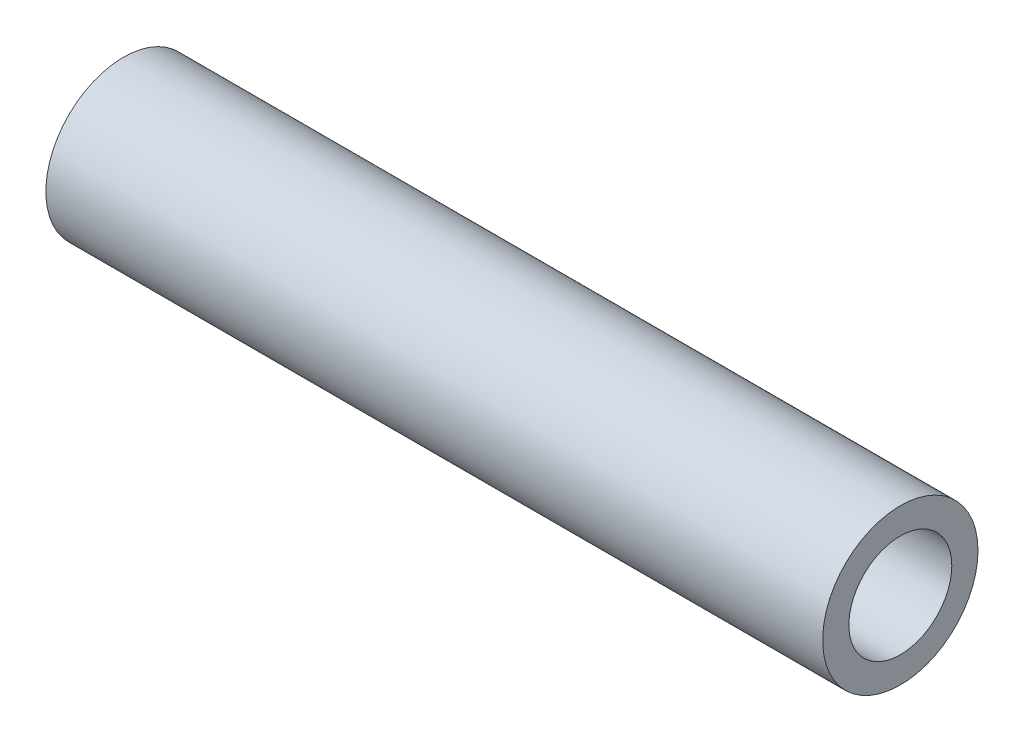
ISO-10303-21;
HEADER;
FILE_DESCRIPTION(('STEP AP214'),'2;1');
FILE_NAME('part.step','',(''),(''),'','','');
FILE_SCHEMA(('AUTOMOTIVE_DESIGN { 1 0 10303 214 1 1 1 1 }'));
ENDSEC;
DATA;
#1=APPLICATION_CONTEXT('core data for automotive mechanical design processes');
#2=APPLICATION_PROTOCOL_DEFINITION('international standard','automotive_design',2000,#1);
#3=PRODUCT_CONTEXT('',#1,'mechanical');
#4=PRODUCT('Part','Part','',(#3));
#5=PRODUCT_RELATED_PRODUCT_CATEGORY('part','',(#4));
#6=PRODUCT_DEFINITION_FORMATION('','',#4);
#7=PRODUCT_DEFINITION_CONTEXT('part definition',#1,'design');
#8=PRODUCT_DEFINITION('design','',#6,#7);
#9=PRODUCT_DEFINITION_SHAPE('','',#8);
#10=(LENGTH_UNIT() NAMED_UNIT(*) SI_UNIT(.MILLI.,.METRE.));
#11=(NAMED_UNIT(*) PLANE_ANGLE_UNIT() SI_UNIT($,.RADIAN.));
#12=(NAMED_UNIT(*) SI_UNIT($,.STERADIAN.) SOLID_ANGLE_UNIT());
#13=UNCERTAINTY_MEASURE_WITH_UNIT(LENGTH_MEASURE(1.E-05),#10,'distance_accuracy_value','');
#14=(GEOMETRIC_REPRESENTATION_CONTEXT(3) GLOBAL_UNCERTAINTY_ASSIGNED_CONTEXT((#13)) GLOBAL_UNIT_ASSIGNED_CONTEXT((#10,
#11,#12)) REPRESENTATION_CONTEXT('',''));
#15=CARTESIAN_POINT('',(0.,0.,0.));
#16=DIRECTION('',(0.,0.,1.));
#17=DIRECTION('',(1.,0.,0.));
#18=AXIS2_PLACEMENT_3D('',#15,#16,#17);
#19=CARTESIAN_POINT('',(40.,0.,0.));
#20=DIRECTION('',(1.,0.,0.));
#21=DIRECTION('',(0.,0.,-1.));
#22=AXIS2_PLACEMENT_3D('',#19,#20,#21);
#23=PLANE('',#22);
#24=CARTESIAN_POINT('',(40.,0.,0.));
#25=DIRECTION('',(1.,0.,0.));
#26=DIRECTION('',(0.,0.,-1.));
#27=AXIS2_PLACEMENT_3D('',#24,#25,#26);
#28=CIRCLE('',#27,4.);
#29=CARTESIAN_POINT('',(40.,0.,-4.));
#30=VERTEX_POINT('',#29);
#31=EDGE_CURVE('E10',#30,#30,#28,.T.);
#32=ORIENTED_EDGE('',*,*,#31,.T.);
#33=EDGE_LOOP('',(#32));
#34=FACE_BOUND('',#33,.T.);
#35=CARTESIAN_POINT('',(40.,0.,0.));
#36=DIRECTION('',(1.,0.,0.));
#37=DIRECTION('',(0.,0.,-1.));
#38=AXIS2_PLACEMENT_3D('',#35,#36,#37);
#39=CIRCLE('',#38,2.65);
#40=CARTESIAN_POINT('',(40.,0.,-2.65));
#41=VERTEX_POINT('',#40);
#42=EDGE_CURVE('E42',#41,#41,#39,.T.);
#43=ORIENTED_EDGE('',*,*,#42,.F.);
#44=EDGE_LOOP('',(#43));
#45=FACE_BOUND('',#44,.T.);
#46=ADVANCED_FACE('F31',(#34,#45),#23,.T.);
#47=CARTESIAN_POINT('',(0.,0.,0.));
#48=DIRECTION('',(1.,0.,0.));
#49=DIRECTION('',(0.,0.,-1.));
#50=AXIS2_PLACEMENT_3D('',#47,#48,#49);
#51=PLANE('',#50);
#52=CARTESIAN_POINT('',(0.,0.,0.));
#53=DIRECTION('',(1.,0.,0.));
#54=DIRECTION('',(0.,0.,-1.));
#55=AXIS2_PLACEMENT_3D('',#52,#53,#54);
#56=CIRCLE('',#55,4.);
#57=CARTESIAN_POINT('',(0.,0.,-4.));
#58=VERTEX_POINT('',#57);
#59=EDGE_CURVE('E35',#58,#58,#56,.T.);
#60=ORIENTED_EDGE('',*,*,#59,.F.);
#61=EDGE_LOOP('',(#60));
#62=FACE_BOUND('',#61,.T.);
#63=CARTESIAN_POINT('',(0.,0.,0.));
#64=DIRECTION('',(1.,0.,0.));
#65=DIRECTION('',(0.,0.,-1.));
#66=AXIS2_PLACEMENT_3D('',#63,#64,#65);
#67=CIRCLE('',#66,2.65);
#68=CARTESIAN_POINT('',(0.,0.,-2.65));
#69=VERTEX_POINT('',#68);
#70=EDGE_CURVE('E44',#69,#69,#67,.T.);
#71=ORIENTED_EDGE('',*,*,#70,.T.);
#72=EDGE_LOOP('',(#71));
#73=FACE_BOUND('',#72,.T.);
#74=ADVANCED_FACE('F54',(#62,#73),#51,.F.);
#75=CARTESIAN_POINT('',(40.,0.,0.));
#76=DIRECTION('',(-1.,0.,0.));
#77=DIRECTION('',(0.,0.,1.));
#78=AXIS2_PLACEMENT_3D('',#75,#76,#77);
#79=CYLINDRICAL_SURFACE('',#78,4.);
#80=ORIENTED_EDGE('',*,*,#31,.F.);
#81=EDGE_LOOP('',(#80));
#82=FACE_BOUND('',#81,.T.);
#83=ORIENTED_EDGE('',*,*,#59,.T.);
#84=EDGE_LOOP('',(#83));
#85=FACE_BOUND('',#84,.T.);
#86=ADVANCED_FACE('F33',(#82,#85),#79,.T.);
#87=CARTESIAN_POINT('',(40.,0.,0.));
#88=DIRECTION('',(-1.,0.,0.));
#89=DIRECTION('',(0.,0.,1.));
#90=AXIS2_PLACEMENT_3D('',#87,#88,#89);
#91=CYLINDRICAL_SURFACE('',#90,2.65);
#92=ORIENTED_EDGE('',*,*,#42,.T.);
#93=EDGE_LOOP('',(#92));
#94=FACE_BOUND('',#93,.T.);
#95=ORIENTED_EDGE('',*,*,#70,.F.);
#96=EDGE_LOOP('',(#95));
#97=FACE_BOUND('',#96,.T.);
#98=ADVANCED_FACE('F50',(#94,#97),#91,.F.);
#99=CLOSED_SHELL('',(#46,#74,#86,#98));
#100=MANIFOLD_SOLID_BREP('B2',#99);
#101=ADVANCED_BREP_SHAPE_REPRESENTATION('',(#18,#100),#14);
#102=SHAPE_DEFINITION_REPRESENTATION(#9,#101);
ENDSEC;
END-ISO-10303-21;
